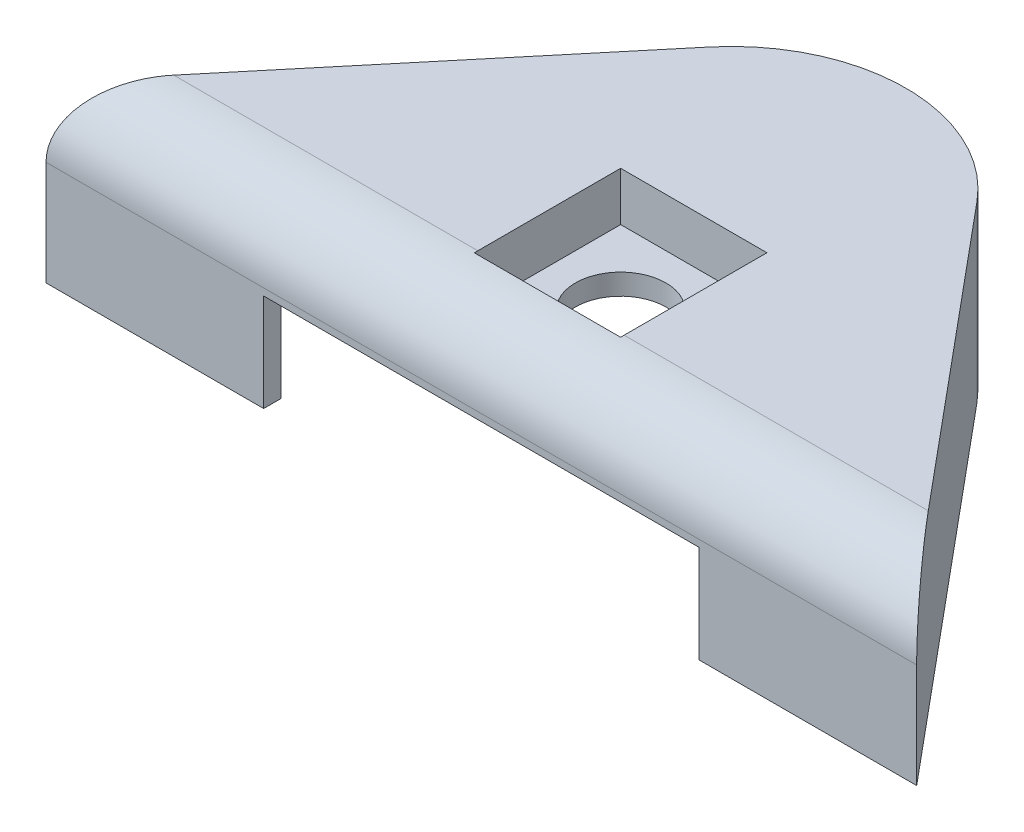
ISO-10303-21;
HEADER;
FILE_DESCRIPTION(('STEP AP214'),'2;1');
FILE_NAME('part.step','',(''),(''),'','','');
FILE_SCHEMA(('AUTOMOTIVE_DESIGN { 1 0 10303 214 1 1 1 1 }'));
ENDSEC;
DATA;
#1=APPLICATION_CONTEXT('core data for automotive mechanical design processes');
#2=APPLICATION_PROTOCOL_DEFINITION('international standard','automotive_design',2000,#1);
#3=PRODUCT_CONTEXT('',#1,'mechanical');
#4=PRODUCT('Part','Part','',(#3));
#5=PRODUCT_RELATED_PRODUCT_CATEGORY('part','',(#4));
#6=PRODUCT_DEFINITION_FORMATION('','',#4);
#7=PRODUCT_DEFINITION_CONTEXT('part definition',#1,'design');
#8=PRODUCT_DEFINITION('design','',#6,#7);
#9=PRODUCT_DEFINITION_SHAPE('','',#8);
#10=(LENGTH_UNIT() NAMED_UNIT(*) SI_UNIT(.MILLI.,.METRE.));
#11=(NAMED_UNIT(*) PLANE_ANGLE_UNIT() SI_UNIT($,.RADIAN.));
#12=(NAMED_UNIT(*) SI_UNIT($,.STERADIAN.) SOLID_ANGLE_UNIT());
#13=UNCERTAINTY_MEASURE_WITH_UNIT(LENGTH_MEASURE(1.E-05),#10,'distance_accuracy_value','');
#14=(GEOMETRIC_REPRESENTATION_CONTEXT(3) GLOBAL_UNCERTAINTY_ASSIGNED_CONTEXT((#13)) GLOBAL_UNIT_ASSIGNED_CONTEXT((#10,
#11,#12)) REPRESENTATION_CONTEXT('',''));
#15=CARTESIAN_POINT('',(0.,0.,0.));
#16=DIRECTION('',(0.,0.,1.));
#17=DIRECTION('',(1.,0.,0.));
#18=AXIS2_PLACEMENT_3D('',#15,#16,#17);
#19=CARTESIAN_POINT('',(0.,50.,3.1024967590666));
#20=DIRECTION('',(0.,-1.,0.));
#21=DIRECTION('',(0.,0.,-1.));
#22=AXIS2_PLACEMENT_3D('',#19,#20,#21);
#23=CYLINDRICAL_SURFACE('',#22,50.);
#24=CARTESIAN_POINT('',(0.,0.,3.1024967590666));
#25=DIRECTION('',(0.,1.,0.));
#26=DIRECTION('',(0.,0.,1.));
#27=AXIS2_PLACEMENT_3D('',#24,#25,#26);
#28=CIRCLE('',#27,50.);
#29=CARTESIAN_POINT('',(-38.4110639798692,0.,-28.9067232241572));
#30=VERTEX_POINT('',#29);
#31=CARTESIAN_POINT('',(38.4110639798689,0.,-28.906723224161));
#32=VERTEX_POINT('',#31);
#33=EDGE_CURVE('E259',#30,#32,#28,.F.);
#34=ORIENTED_EDGE('',*,*,#33,.F.);
#35=DIRECTION('',(0.,-1.,0.));
#36=VECTOR('',#35,1.);
#37=CARTESIAN_POINT('',(-38.4110639798692,50.,-28.9067232241572));
#38=LINE('',#37,#36);
#39=CARTESIAN_POINT('',(-38.4110639798692,50.,-28.9067232241572));
#40=VERTEX_POINT('',#39);
#41=EDGE_CURVE('E290',#40,#30,#38,.T.);
#42=ORIENTED_EDGE('',*,*,#41,.F.);
#43=CARTESIAN_POINT('',(0.,50.,3.1024967590666));
#44=DIRECTION('',(0.,1.,0.));
#45=DIRECTION('',(0.,0.,1.));
#46=AXIS2_PLACEMENT_3D('',#43,#44,#45);
#47=CIRCLE('',#46,50.);
#48=CARTESIAN_POINT('',(38.4110639798689,50.,-28.906723224161));
#49=VERTEX_POINT('',#48);
#50=EDGE_CURVE('E265',#40,#49,#47,.F.);
#51=ORIENTED_EDGE('',*,*,#50,.T.);
#52=DIRECTION('',(0.,-1.,0.));
#53=VECTOR('',#52,1.);
#54=CARTESIAN_POINT('',(38.4110639798689,50.,-28.906723224161));
#55=LINE('',#54,#53);
#56=EDGE_CURVE('E273',#49,#32,#55,.T.);
#57=ORIENTED_EDGE('',*,*,#56,.T.);
#58=EDGE_LOOP('',(#34,#42,#51,#57));
#59=FACE_BOUND('',#58,.T.);
#60=ADVANCED_FACE('F41',(#59),#23,.T.);
#61=CARTESIAN_POINT('',(-36.8852459016318,50.,-30.7377049180366));
#62=DIRECTION('',(-0.768221279597376,0.,-0.64018439966448));
#63=DIRECTION('',(-0.64018439966448,0.,0.768221279597376));
#64=AXIS2_PLACEMENT_3D('',#61,#62,#63);
#65=PLANE('',#64);
#66=DIRECTION('',(0.,-1.,0.));
#67=VECTOR('',#66,1.);
#68=CARTESIAN_POINT('',(-124.999999999992,50.,75.));
#69=LINE('',#68,#67);
#70=CARTESIAN_POINT('',(-124.999999999992,30.,75.));
#71=VERTEX_POINT('',#70);
#72=CARTESIAN_POINT('',(-124.999999999992,0.,75.));
#73=VERTEX_POINT('',#72);
#74=EDGE_CURVE('E288',#71,#73,#69,.T.);
#75=ORIENTED_EDGE('',*,*,#74,.F.);
#76=CARTESIAN_POINT('',(-108.333333333329,30.,55.));
#77=DIRECTION('',(-0.768221279597376,0.,-0.64018439966448));
#78=DIRECTION('',(-0.64018439966448,0.,0.768221279597376));
#79=AXIS2_PLACEMENT_3D('',#76,#77,#78);
#80=ELLIPSE('',#79,26.0341655863555,20.);
#81=CARTESIAN_POINT('',(-108.333333333329,50.,55.));
#82=VERTEX_POINT('',#81);
#83=EDGE_CURVE('E12',#71,#82,#80,.T.);
#84=ORIENTED_EDGE('',*,*,#83,.T.);
#85=DIRECTION('',(0.64018439966448,0.,-0.768221279597376));
#86=VECTOR('',#85,1.);
#87=CARTESIAN_POINT('',(-36.8852459016318,50.,-30.7377049180366));
#88=LINE('',#87,#86);
#89=EDGE_CURVE('E268',#82,#40,#88,.T.);
#90=ORIENTED_EDGE('',*,*,#89,.T.);
#91=ORIENTED_EDGE('',*,*,#41,.T.);
#92=DIRECTION('',(0.64018439966448,0.,-0.768221279597376));
#93=VECTOR('',#92,1.);
#94=CARTESIAN_POINT('',(-36.8852459016318,0.,-30.7377049180366));
#95=LINE('',#94,#93);
#96=EDGE_CURVE('E276',#73,#30,#95,.T.);
#97=ORIENTED_EDGE('',*,*,#96,.F.);
#98=EDGE_LOOP('',(#75,#84,#90,#91,#97));
#99=FACE_BOUND('',#98,.T.);
#100=ADVANCED_FACE('F325',(#99),#65,.T.);
#101=CARTESIAN_POINT('',(7.7715611723761E-12,50.,75.));
#102=DIRECTION('',(0.,0.,-1.));
#103=DIRECTION('',(-1.,0.,0.));
#104=AXIS2_PLACEMENT_3D('',#101,#102,#103);
#105=PLANE('',#104);
#106=DIRECTION('',(0.,-1.,0.));
#107=VECTOR('',#106,1.);
#108=CARTESIAN_POINT('',(125.,50.,75.0000000000001));
#109=LINE('',#108,#107);
#110=CARTESIAN_POINT('',(125.,30.,75.0000000000001));
#111=VERTEX_POINT('',#110);
#112=CARTESIAN_POINT('',(125.,0.,75.0000000000001));
#113=VERTEX_POINT('',#112);
#114=EDGE_CURVE('E286',#111,#113,#109,.T.);
#115=ORIENTED_EDGE('',*,*,#114,.F.);
#116=DIRECTION('',(1.,0.,0.));
#117=VECTOR('',#116,1.);
#118=CARTESIAN_POINT('',(-124.999999999992,30.,75.));
#119=LINE('',#118,#117);
#120=EDGE_CURVE('E49',#111,#71,#119,.F.);
#121=ORIENTED_EDGE('',*,*,#120,.T.);
#122=ORIENTED_EDGE('',*,*,#74,.T.);
#123=DIRECTION('',(1.,0.,0.));
#124=VECTOR('',#123,1.);
#125=CARTESIAN_POINT('',(7.7715611723761E-12,0.,75.));
#126=LINE('',#125,#124);
#127=CARTESIAN_POINT('',(-62.5,0.,75.));
#128=VERTEX_POINT('',#127);
#129=EDGE_CURVE('E280',#73,#128,#126,.T.);
#130=ORIENTED_EDGE('',*,*,#129,.T.);
#131=DIRECTION('',(0.,-1.,0.));
#132=VECTOR('',#131,1.);
#133=CARTESIAN_POINT('',(-62.5,28.,75.));
#134=LINE('',#133,#132);
#135=CARTESIAN_POINT('',(-62.5,28.,75.));
#136=VERTEX_POINT('',#135);
#137=EDGE_CURVE('E253',#136,#128,#134,.T.);
#138=ORIENTED_EDGE('',*,*,#137,.F.);
#139=DIRECTION('',(-1.,0.,0.));
#140=VECTOR('',#139,1.);
#141=CARTESIAN_POINT('',(-62.5,28.,75.));
#142=LINE('',#141,#140);
#143=CARTESIAN_POINT('',(62.5,28.,75.));
#144=VERTEX_POINT('',#143);
#145=EDGE_CURVE('E250',#144,#136,#142,.T.);
#146=ORIENTED_EDGE('',*,*,#145,.F.);
#147=DIRECTION('',(0.,1.,0.));
#148=VECTOR('',#147,1.);
#149=CARTESIAN_POINT('',(62.5,0.,75.));
#150=LINE('',#149,#148);
#151=CARTESIAN_POINT('',(62.5,0.,75.));
#152=VERTEX_POINT('',#151);
#153=EDGE_CURVE('E247',#152,#144,#150,.T.);
#154=ORIENTED_EDGE('',*,*,#153,.F.);
#155=EDGE_CURVE('E279',#152,#113,#126,.T.);
#156=ORIENTED_EDGE('',*,*,#155,.T.);
#157=EDGE_LOOP('',(#115,#121,#122,#130,#138,#146,#154,#156));
#158=FACE_BOUND('',#157,.T.);
#159=ADVANCED_FACE('F339',(#158),#105,.F.);
#160=CARTESIAN_POINT('',(36.8852459016471,50.,-30.7377049180328));
#161=DIRECTION('',(0.768221279597376,0.,-0.64018439966448));
#162=DIRECTION('',(-0.64018439966448,0.,-0.768221279597376));
#163=AXIS2_PLACEMENT_3D('',#160,#161,#162);
#164=PLANE('',#163);
#165=DIRECTION('',(0.64018439966448,0.,0.768221279597376));
#166=VECTOR('',#165,1.);
#167=CARTESIAN_POINT('',(36.8852459016471,50.,-30.7377049180328));
#168=LINE('',#167,#166);
#169=CARTESIAN_POINT('',(108.333333333341,50.,54.9999999999999));
#170=VERTEX_POINT('',#169);
#171=EDGE_CURVE('E271',#49,#170,#168,.T.);
#172=ORIENTED_EDGE('',*,*,#171,.T.);
#173=CARTESIAN_POINT('',(108.333333333341,30.,55.));
#174=DIRECTION('',(0.768221279597376,0.,-0.64018439966448));
#175=DIRECTION('',(-0.64018439966448,0.,-0.768221279597376));
#176=AXIS2_PLACEMENT_3D('',#173,#174,#175);
#177=ELLIPSE('',#176,26.0341655863555,20.);
#178=EDGE_CURVE('E63',#170,#111,#177,.T.);
#179=ORIENTED_EDGE('',*,*,#178,.T.);
#180=ORIENTED_EDGE('',*,*,#114,.T.);
#181=DIRECTION('',(0.64018439966448,0.,0.768221279597376));
#182=VECTOR('',#181,1.);
#183=CARTESIAN_POINT('',(36.8852459016471,0.,-30.7377049180328));
#184=LINE('',#183,#182);
#185=EDGE_CURVE('E269',#32,#113,#184,.T.);
#186=ORIENTED_EDGE('',*,*,#185,.F.);
#187=ORIENTED_EDGE('',*,*,#56,.F.);
#188=EDGE_LOOP('',(#172,#179,#180,#186,#187));
#189=FACE_BOUND('',#188,.T.);
#190=ADVANCED_FACE('F354',(#189),#164,.T.);
#191=CARTESIAN_POINT('',(0.,50.,0.));
#192=DIRECTION('',(0.,1.,0.));
#193=DIRECTION('',(0.,0.,1.));
#194=AXIS2_PLACEMENT_3D('',#191,#192,#193);
#195=PLANE('',#194);
#196=ORIENTED_EDGE('',*,*,#89,.F.);
#197=DIRECTION('',(1.,0.,0.));
#198=VECTOR('',#197,1.);
#199=CARTESIAN_POINT('',(125.,50.,55.));
#200=LINE('',#199,#198);
#201=CARTESIAN_POINT('',(-21.,50.,55.));
#202=VERTEX_POINT('',#201);
#203=EDGE_CURVE('E301',#82,#202,#200,.T.);
#204=ORIENTED_EDGE('',*,*,#203,.T.);
#205=DIRECTION('',(0.,0.,1.));
#206=VECTOR('',#205,1.);
#207=CARTESIAN_POINT('',(-21.,50.,56.));
#208=LINE('',#207,#206);
#209=CARTESIAN_POINT('',(-21.,50.,14.));
#210=VERTEX_POINT('',#209);
#211=EDGE_CURVE('E190',#210,#202,#208,.T.);
#212=ORIENTED_EDGE('',*,*,#211,.F.);
#213=DIRECTION('',(-1.,0.,0.));
#214=VECTOR('',#213,1.);
#215=CARTESIAN_POINT('',(-21.,50.,14.));
#216=LINE('',#215,#214);
#217=CARTESIAN_POINT('',(21.,50.,14.));
#218=VERTEX_POINT('',#217);
#219=EDGE_CURVE('E183',#218,#210,#216,.T.);
#220=ORIENTED_EDGE('',*,*,#219,.F.);
#221=DIRECTION('',(0.,0.,-1.));
#222=VECTOR('',#221,1.);
#223=CARTESIAN_POINT('',(21.,50.,56.));
#224=LINE('',#223,#222);
#225=CARTESIAN_POINT('',(21.,50.,55.));
#226=VERTEX_POINT('',#225);
#227=EDGE_CURVE('E195',#226,#218,#224,.T.);
#228=ORIENTED_EDGE('',*,*,#227,.F.);
#229=DIRECTION('',(1.,0.,0.));
#230=VECTOR('',#229,1.);
#231=CARTESIAN_POINT('',(125.,50.,55.));
#232=LINE('',#231,#230);
#233=EDGE_CURVE('E295',#226,#170,#232,.T.);
#234=ORIENTED_EDGE('',*,*,#233,.T.);
#235=ORIENTED_EDGE('',*,*,#171,.F.);
#236=ORIENTED_EDGE('',*,*,#50,.F.);
#237=EDGE_LOOP('',(#196,#204,#212,#220,#228,#234,#235,#236));
#238=FACE_BOUND('',#237,.T.);
#239=ADVANCED_FACE('F320',(#238),#195,.T.);
#240=CARTESIAN_POINT('',(0.,0.,0.));
#241=DIRECTION('',(0.,1.,0.));
#242=DIRECTION('',(0.,0.,1.));
#243=AXIS2_PLACEMENT_3D('',#240,#241,#242);
#244=PLANE('',#243);
#245=DIRECTION('',(0.640184399664445,0.,-0.768221279597404));
#246=VECTOR('',#245,1.);
#247=CARTESIAN_POINT('',(-114.324791936737,0.,69.9999999999999));
#248=LINE('',#247,#246);
#249=CARTESIAN_POINT('',(-114.324791936737,0.,69.9999999999999));
#250=VERTEX_POINT('',#249);
#251=CARTESIAN_POINT('',(-34.569957581882,0.,-25.7058012258351));
#252=VERTEX_POINT('',#251);
#253=EDGE_CURVE('E211',#250,#252,#248,.T.);
#254=ORIENTED_EDGE('',*,*,#253,.F.);
#255=DIRECTION('',(-1.,0.,0.));
#256=VECTOR('',#255,1.);
#257=CARTESIAN_POINT('',(114.324791936745,0.,70.));
#258=LINE('',#257,#256);
#259=CARTESIAN_POINT('',(-62.5,0.,69.9999999999999));
#260=VERTEX_POINT('',#259);
#261=EDGE_CURVE('E228',#260,#250,#258,.T.);
#262=ORIENTED_EDGE('',*,*,#261,.F.);
#263=DIRECTION('',(0.,0.,1.));
#264=VECTOR('',#263,1.);
#265=CARTESIAN_POINT('',(-62.5,0.,45.));
#266=LINE('',#265,#264);
#267=EDGE_CURVE('E260',#260,#128,#266,.T.);
#268=ORIENTED_EDGE('',*,*,#267,.T.);
#269=ORIENTED_EDGE('',*,*,#129,.F.);
#270=ORIENTED_EDGE('',*,*,#96,.T.);
#271=ORIENTED_EDGE('',*,*,#33,.T.);
#272=ORIENTED_EDGE('',*,*,#185,.T.);
#273=ORIENTED_EDGE('',*,*,#155,.F.);
#274=DIRECTION('',(0.,0.,1.));
#275=VECTOR('',#274,1.);
#276=CARTESIAN_POINT('',(62.5,0.,45.));
#277=LINE('',#276,#275);
#278=CARTESIAN_POINT('',(62.5,0.,70.));
#279=VERTEX_POINT('',#278);
#280=EDGE_CURVE('E257',#279,#152,#277,.T.);
#281=ORIENTED_EDGE('',*,*,#280,.F.);
#282=CARTESIAN_POINT('',(114.324791936745,0.,70.));
#283=VERTEX_POINT('',#282);
#284=EDGE_CURVE('E229',#283,#279,#258,.T.);
#285=ORIENTED_EDGE('',*,*,#284,.F.);
#286=DIRECTION('',(0.640184399664467,0.,0.768221279597387));
#287=VECTOR('',#286,1.);
#288=CARTESIAN_POINT('',(34.5699575818841,0.,-25.7058012258361));
#289=LINE('',#288,#287);
#290=CARTESIAN_POINT('',(34.5699575818841,0.,-25.7058012258361));
#291=VERTEX_POINT('',#290);
#292=EDGE_CURVE('E224',#291,#283,#289,.T.);
#293=ORIENTED_EDGE('',*,*,#292,.F.);
#294=CARTESIAN_POINT('',(1.47286870200159E-12,0.,3.1024967590646));
#295=DIRECTION('',(0.,-1.,0.));
#296=DIRECTION('',(0.,0.,-1.));
#297=AXIS2_PLACEMENT_3D('',#294,#295,#296);
#298=CIRCLE('',#297,45.);
#299=EDGE_CURVE('E221',#252,#291,#298,.T.);
#300=ORIENTED_EDGE('',*,*,#299,.F.);
#301=EDGE_LOOP('',(#254,#262,#268,#269,#270,#271,#272,#273,#281,#285,#293,#300));
#302=FACE_BOUND('',#301,.T.);
#303=ADVANCED_FACE('F334',(#302),#244,.F.);
#304=CARTESIAN_POINT('',(62.5,0.,45.));
#305=DIRECTION('',(1.,0.,0.));
#306=DIRECTION('',(0.,0.,-1.));
#307=AXIS2_PLACEMENT_3D('',#304,#305,#306);
#308=PLANE('',#307);
#309=DIRECTION('',(0.,0.,1.));
#310=VECTOR('',#309,1.);
#311=CARTESIAN_POINT('',(62.5,28.,45.));
#312=LINE('',#311,#310);
#313=CARTESIAN_POINT('',(62.5,28.,70.));
#314=VERTEX_POINT('',#313);
#315=EDGE_CURVE('E256',#314,#144,#312,.T.);
#316=ORIENTED_EDGE('',*,*,#315,.F.);
#317=DIRECTION('',(0.,-1.,0.));
#318=VECTOR('',#317,1.);
#319=CARTESIAN_POINT('',(62.5,0.,70.));
#320=LINE('',#319,#318);
#321=EDGE_CURVE('E244',#314,#279,#320,.T.);
#322=ORIENTED_EDGE('',*,*,#321,.T.);
#323=ORIENTED_EDGE('',*,*,#280,.T.);
#324=ORIENTED_EDGE('',*,*,#153,.T.);
#325=EDGE_LOOP('',(#316,#322,#323,#324));
#326=FACE_BOUND('',#325,.T.);
#327=ADVANCED_FACE('F349',(#326),#308,.F.);
#328=CARTESIAN_POINT('',(-62.5,28.,45.));
#329=DIRECTION('',(-1.,0.,0.));
#330=DIRECTION('',(0.,0.,1.));
#331=AXIS2_PLACEMENT_3D('',#328,#329,#330);
#332=PLANE('',#331);
#333=ORIENTED_EDGE('',*,*,#267,.F.);
#334=DIRECTION('',(0.,1.,0.));
#335=VECTOR('',#334,1.);
#336=CARTESIAN_POINT('',(-62.5,28.,69.9999999999999));
#337=LINE('',#336,#335);
#338=CARTESIAN_POINT('',(-62.5,28.,69.9999999999999));
#339=VERTEX_POINT('',#338);
#340=EDGE_CURVE('E235',#260,#339,#337,.T.);
#341=ORIENTED_EDGE('',*,*,#340,.T.);
#342=DIRECTION('',(0.,0.,1.));
#343=VECTOR('',#342,1.);
#344=CARTESIAN_POINT('',(-62.5,28.,45.));
#345=LINE('',#344,#343);
#346=EDGE_CURVE('E262',#339,#136,#345,.T.);
#347=ORIENTED_EDGE('',*,*,#346,.T.);
#348=ORIENTED_EDGE('',*,*,#137,.T.);
#349=EDGE_LOOP('',(#333,#341,#347,#348));
#350=FACE_BOUND('',#349,.T.);
#351=ADVANCED_FACE('F343',(#350),#332,.F.);
#352=CARTESIAN_POINT('',(-62.5,28.,45.));
#353=DIRECTION('',(0.,1.,0.));
#354=DIRECTION('',(-1.,0.,0.));
#355=AXIS2_PLACEMENT_3D('',#352,#353,#354);
#356=PLANE('',#355);
#357=ORIENTED_EDGE('',*,*,#346,.F.);
#358=DIRECTION('',(1.,0.,0.));
#359=VECTOR('',#358,1.);
#360=CARTESIAN_POINT('',(-62.5,28.,69.9999999999999));
#361=LINE('',#360,#359);
#362=EDGE_CURVE('E292',#339,#314,#361,.T.);
#363=ORIENTED_EDGE('',*,*,#362,.T.);
#364=ORIENTED_EDGE('',*,*,#315,.T.);
#365=ORIENTED_EDGE('',*,*,#145,.T.);
#366=EDGE_LOOP('',(#357,#363,#364,#365));
#367=FACE_BOUND('',#366,.T.);
#368=ADVANCED_FACE('F346',(#367),#356,.F.);
#369=CARTESIAN_POINT('',(114.324791936745,30.,70.));
#370=DIRECTION('',(0.,0.,1.));
#371=DIRECTION('',(1.,0.,0.));
#372=AXIS2_PLACEMENT_3D('',#369,#370,#371);
#373=PLANE('',#372);
#374=ORIENTED_EDGE('',*,*,#362,.F.);
#375=ORIENTED_EDGE('',*,*,#340,.F.);
#376=ORIENTED_EDGE('',*,*,#261,.T.);
#377=DIRECTION('',(0.,-1.,0.));
#378=VECTOR('',#377,1.);
#379=CARTESIAN_POINT('',(-114.324791936737,30.,69.9999999999999));
#380=LINE('',#379,#378);
#381=CARTESIAN_POINT('',(-114.324791936737,30.,69.9999999999999));
#382=VERTEX_POINT('',#381);
#383=EDGE_CURVE('E236',#382,#250,#380,.T.);
#384=ORIENTED_EDGE('',*,*,#383,.F.);
#385=DIRECTION('',(-1.,0.,0.));
#386=VECTOR('',#385,1.);
#387=CARTESIAN_POINT('',(114.324791936745,30.,70.));
#388=LINE('',#387,#386);
#389=CARTESIAN_POINT('',(114.324791936745,30.,70.));
#390=VERTEX_POINT('',#389);
#391=EDGE_CURVE('E214',#390,#382,#388,.T.);
#392=ORIENTED_EDGE('',*,*,#391,.F.);
#393=DIRECTION('',(0.,-1.,0.));
#394=VECTOR('',#393,1.);
#395=CARTESIAN_POINT('',(114.324791936745,30.,70.));
#396=LINE('',#395,#394);
#397=EDGE_CURVE('E239',#390,#283,#396,.T.);
#398=ORIENTED_EDGE('',*,*,#397,.T.);
#399=ORIENTED_EDGE('',*,*,#284,.T.);
#400=ORIENTED_EDGE('',*,*,#321,.F.);
#401=EDGE_LOOP('',(#374,#375,#376,#384,#392,#398,#399,#400));
#402=FACE_BOUND('',#401,.T.);
#403=ADVANCED_FACE('F424',(#402),#373,.F.);
#404=CARTESIAN_POINT('',(1.47286870200159E-12,30.,3.1024967590646));
#405=DIRECTION('',(0.,-1.,0.));
#406=DIRECTION('',(0.,0.,-1.));
#407=AXIS2_PLACEMENT_3D('',#404,#405,#406);
#408=CYLINDRICAL_SURFACE('',#407,45.);
#409=ORIENTED_EDGE('',*,*,#299,.T.);
#410=DIRECTION('',(0.,-1.,0.));
#411=VECTOR('',#410,1.);
#412=CARTESIAN_POINT('',(34.5699575818841,30.,-25.7058012258361));
#413=LINE('',#412,#411);
#414=CARTESIAN_POINT('',(34.5699575818841,30.,-25.7058012258361));
#415=VERTEX_POINT('',#414);
#416=EDGE_CURVE('E220',#415,#291,#413,.T.);
#417=ORIENTED_EDGE('',*,*,#416,.F.);
#418=CARTESIAN_POINT('',(1.47286870200159E-12,30.,3.1024967590646));
#419=DIRECTION('',(0.,-1.,0.));
#420=DIRECTION('',(0.,0.,-1.));
#421=AXIS2_PLACEMENT_3D('',#418,#419,#420);
#422=CIRCLE('',#421,45.);
#423=CARTESIAN_POINT('',(-34.569957581882,30.,-25.7058012258351));
#424=VERTEX_POINT('',#423);
#425=EDGE_CURVE('E207',#424,#415,#422,.T.);
#426=ORIENTED_EDGE('',*,*,#425,.F.);
#427=DIRECTION('',(0.,-1.,0.));
#428=VECTOR('',#427,1.);
#429=CARTESIAN_POINT('',(-34.569957581882,30.,-25.7058012258351));
#430=LINE('',#429,#428);
#431=EDGE_CURVE('E233',#424,#252,#430,.T.);
#432=ORIENTED_EDGE('',*,*,#431,.T.);
#433=EDGE_LOOP('',(#409,#417,#426,#432));
#434=FACE_BOUND('',#433,.T.);
#435=ADVANCED_FACE('F433',(#434),#408,.F.);
#436=CARTESIAN_POINT('',(-114.324791936737,30.,69.9999999999999));
#437=DIRECTION('',(-0.768221279597404,0.,-0.640184399664445));
#438=DIRECTION('',(-0.640184399664445,0.,0.768221279597404));
#439=AXIS2_PLACEMENT_3D('',#436,#437,#438);
#440=PLANE('',#439);
#441=ORIENTED_EDGE('',*,*,#253,.T.);
#442=ORIENTED_EDGE('',*,*,#431,.F.);
#443=DIRECTION('',(0.640184399664445,0.,-0.768221279597404));
#444=VECTOR('',#443,1.);
#445=CARTESIAN_POINT('',(-114.324791936737,30.,69.9999999999999));
#446=LINE('',#445,#444);
#447=EDGE_CURVE('E217',#382,#424,#446,.T.);
#448=ORIENTED_EDGE('',*,*,#447,.F.);
#449=ORIENTED_EDGE('',*,*,#383,.T.);
#450=EDGE_LOOP('',(#441,#442,#448,#449));
#451=FACE_BOUND('',#450,.T.);
#452=ADVANCED_FACE('F443',(#451),#440,.F.);
#453=CARTESIAN_POINT('',(34.5699575818841,30.,-25.7058012258361));
#454=DIRECTION('',(0.768221279597387,0.,-0.640184399664467));
#455=DIRECTION('',(-0.640184399664467,0.,-0.768221279597387));
#456=AXIS2_PLACEMENT_3D('',#453,#454,#455);
#457=PLANE('',#456);
#458=ORIENTED_EDGE('',*,*,#292,.T.);
#459=ORIENTED_EDGE('',*,*,#397,.F.);
#460=DIRECTION('',(0.640184399664467,0.,0.768221279597387));
#461=VECTOR('',#460,1.);
#462=CARTESIAN_POINT('',(34.5699575818841,30.,-25.7058012258361));
#463=LINE('',#462,#461);
#464=EDGE_CURVE('E210',#415,#390,#463,.T.);
#465=ORIENTED_EDGE('',*,*,#464,.F.);
#466=ORIENTED_EDGE('',*,*,#416,.T.);
#467=EDGE_LOOP('',(#458,#459,#465,#466));
#468=FACE_BOUND('',#467,.T.);
#469=ADVANCED_FACE('F453',(#468),#457,.F.);
#470=CARTESIAN_POINT('',(1.47286870200159E-12,30.,3.1024967590646));
#471=DIRECTION('',(0.,-1.,0.));
#472=DIRECTION('',(0.,0.,-1.));
#473=AXIS2_PLACEMENT_3D('',#470,#471,#472);
#474=PLANE('',#473);
#475=CARTESIAN_POINT('',(0.,30.,35.));
#476=DIRECTION('',(0.,-1.,0.));
#477=DIRECTION('',(0.,0.,-1.));
#478=AXIS2_PLACEMENT_3D('',#475,#476,#477);
#479=CIRCLE('',#478,13.);
#480=CARTESIAN_POINT('',(0.,30.,22.));
#481=VERTEX_POINT('',#480);
#482=EDGE_CURVE('E225',#481,#481,#479,.T.);
#483=ORIENTED_EDGE('',*,*,#482,.F.);
#484=EDGE_LOOP('',(#483));
#485=FACE_BOUND('',#484,.T.);
#486=ORIENTED_EDGE('',*,*,#425,.T.);
#487=ORIENTED_EDGE('',*,*,#464,.T.);
#488=ORIENTED_EDGE('',*,*,#391,.T.);
#489=ORIENTED_EDGE('',*,*,#447,.T.);
#490=EDGE_LOOP('',(#486,#487,#488,#489));
#491=FACE_BOUND('',#490,.T.);
#492=ADVANCED_FACE('F463',(#485,#491),#474,.T.);
#493=CARTESIAN_POINT('',(0.,20.,35.));
#494=DIRECTION('',(0.,1.,0.));
#495=DIRECTION('',(0.,0.,1.));
#496=AXIS2_PLACEMENT_3D('',#493,#494,#495);
#497=CYLINDRICAL_SURFACE('',#496,13.);
#498=CARTESIAN_POINT('',(0.,36.,35.));
#499=DIRECTION('',(0.,-1.,0.));
#500=DIRECTION('',(0.,0.,-1.));
#501=AXIS2_PLACEMENT_3D('',#498,#499,#500);
#502=CIRCLE('',#501,13.);
#503=CARTESIAN_POINT('',(0.,36.,22.));
#504=VERTEX_POINT('',#503);
#505=EDGE_CURVE('E206',#504,#504,#502,.F.);
#506=ORIENTED_EDGE('',*,*,#505,.T.);
#507=EDGE_LOOP('',(#506));
#508=FACE_BOUND('',#507,.T.);
#509=ORIENTED_EDGE('',*,*,#482,.T.);
#510=EDGE_LOOP('',(#509));
#511=FACE_BOUND('',#510,.T.);
#512=ADVANCED_FACE('F473',(#508,#511),#497,.F.);
#513=CARTESIAN_POINT('',(1.47286870200159E-12,36.,3.1024967590646));
#514=DIRECTION('',(0.,-1.,0.));
#515=DIRECTION('',(0.,0.,-1.));
#516=AXIS2_PLACEMENT_3D('',#513,#514,#515);
#517=PLANE('',#516);
#518=DIRECTION('',(0.,0.,-1.));
#519=VECTOR('',#518,1.);
#520=CARTESIAN_POINT('',(21.,36.,56.));
#521=LINE('',#520,#519);
#522=CARTESIAN_POINT('',(21.,36.,56.));
#523=VERTEX_POINT('',#522);
#524=CARTESIAN_POINT('',(21.,36.,14.));
#525=VERTEX_POINT('',#524);
#526=EDGE_CURVE('E188',#523,#525,#521,.T.);
#527=ORIENTED_EDGE('',*,*,#526,.T.);
#528=DIRECTION('',(-1.,0.,0.));
#529=VECTOR('',#528,1.);
#530=CARTESIAN_POINT('',(-21.,36.,14.));
#531=LINE('',#530,#529);
#532=CARTESIAN_POINT('',(-21.,36.,14.));
#533=VERTEX_POINT('',#532);
#534=EDGE_CURVE('E180',#525,#533,#531,.T.);
#535=ORIENTED_EDGE('',*,*,#534,.T.);
#536=DIRECTION('',(0.,0.,1.));
#537=VECTOR('',#536,1.);
#538=CARTESIAN_POINT('',(-21.,36.,56.));
#539=LINE('',#538,#537);
#540=CARTESIAN_POINT('',(-21.,36.,56.));
#541=VERTEX_POINT('',#540);
#542=EDGE_CURVE('E165',#533,#541,#539,.T.);
#543=ORIENTED_EDGE('',*,*,#542,.T.);
#544=DIRECTION('',(1.,0.,0.));
#545=VECTOR('',#544,1.);
#546=CARTESIAN_POINT('',(-21.,36.,56.));
#547=LINE('',#546,#545);
#548=EDGE_CURVE('E200',#541,#523,#547,.T.);
#549=ORIENTED_EDGE('',*,*,#548,.T.);
#550=EDGE_LOOP('',(#527,#535,#543,#549));
#551=FACE_BOUND('',#550,.T.);
#552=ORIENTED_EDGE('',*,*,#505,.F.);
#553=EDGE_LOOP('',(#552));
#554=FACE_BOUND('',#553,.T.);
#555=ADVANCED_FACE('F186',(#551,#554),#517,.F.);
#556=CARTESIAN_POINT('',(-21.,-29.39696961967,14.));
#557=DIRECTION('',(0.,0.,-1.));
#558=DIRECTION('',(-1.,0.,0.));
#559=AXIS2_PLACEMENT_3D('',#556,#557,#558);
#560=PLANE('',#559);
#561=DIRECTION('',(0.,1.,0.));
#562=VECTOR('',#561,1.);
#563=CARTESIAN_POINT('',(21.,-29.39696961967,14.));
#564=LINE('',#563,#562);
#565=EDGE_CURVE('E198',#525,#218,#564,.T.);
#566=ORIENTED_EDGE('',*,*,#565,.T.);
#567=ORIENTED_EDGE('',*,*,#219,.T.);
#568=DIRECTION('',(0.,1.,0.));
#569=VECTOR('',#568,1.);
#570=CARTESIAN_POINT('',(-21.,-29.39696961967,14.));
#571=LINE('',#570,#569);
#572=EDGE_CURVE('E169',#533,#210,#571,.T.);
#573=ORIENTED_EDGE('',*,*,#572,.F.);
#574=ORIENTED_EDGE('',*,*,#534,.F.);
#575=EDGE_LOOP('',(#566,#567,#573,#574));
#576=FACE_BOUND('',#575,.T.);
#577=ADVANCED_FACE('F179',(#576),#560,.F.);
#578=CARTESIAN_POINT('',(-21.,-29.39696961967,56.));
#579=DIRECTION('',(-1.,0.,0.));
#580=DIRECTION('',(0.,0.,1.));
#581=AXIS2_PLACEMENT_3D('',#578,#579,#580);
#582=PLANE('',#581);
#583=ORIENTED_EDGE('',*,*,#211,.T.);
#584=CARTESIAN_POINT('',(-21.,30.,55.));
#585=DIRECTION('',(-1.,0.,0.));
#586=DIRECTION('',(0.,0.,1.));
#587=AXIS2_PLACEMENT_3D('',#584,#585,#586);
#588=CIRCLE('',#587,20.);
#589=CARTESIAN_POINT('',(-21.,49.9749843554382,56.));
#590=VERTEX_POINT('',#589);
#591=EDGE_CURVE('E304',#202,#590,#588,.F.);
#592=ORIENTED_EDGE('',*,*,#591,.T.);
#593=DIRECTION('',(0.,1.,0.));
#594=VECTOR('',#593,1.);
#595=CARTESIAN_POINT('',(-21.,-29.39696961967,56.));
#596=LINE('',#595,#594);
#597=EDGE_CURVE('E172',#541,#590,#596,.T.);
#598=ORIENTED_EDGE('',*,*,#597,.F.);
#599=ORIENTED_EDGE('',*,*,#542,.F.);
#600=ORIENTED_EDGE('',*,*,#572,.T.);
#601=EDGE_LOOP('',(#583,#592,#598,#599,#600));
#602=FACE_BOUND('',#601,.T.);
#603=ADVANCED_FACE('F168',(#602),#582,.F.);
#604=CARTESIAN_POINT('',(-21.,-29.39696961967,56.));
#605=DIRECTION('',(0.,0.,1.));
#606=DIRECTION('',(1.,0.,0.));
#607=AXIS2_PLACEMENT_3D('',#604,#605,#606);
#608=PLANE('',#607);
#609=ORIENTED_EDGE('',*,*,#597,.T.);
#610=DIRECTION('',(-1.,0.,0.));
#611=VECTOR('',#610,1.);
#612=CARTESIAN_POINT('',(-21.,49.9749843554382,56.));
#613=LINE('',#612,#611);
#614=CARTESIAN_POINT('',(21.,49.9749843554382,56.));
#615=VERTEX_POINT('',#614);
#616=EDGE_CURVE('E306',#590,#615,#613,.F.);
#617=ORIENTED_EDGE('',*,*,#616,.T.);
#618=DIRECTION('',(0.,1.,0.));
#619=VECTOR('',#618,1.);
#620=CARTESIAN_POINT('',(21.,-29.39696961967,56.));
#621=LINE('',#620,#619);
#622=EDGE_CURVE('E199',#523,#615,#621,.T.);
#623=ORIENTED_EDGE('',*,*,#622,.F.);
#624=ORIENTED_EDGE('',*,*,#548,.F.);
#625=EDGE_LOOP('',(#609,#617,#623,#624));
#626=FACE_BOUND('',#625,.T.);
#627=ADVANCED_FACE('F503',(#626),#608,.F.);
#628=CARTESIAN_POINT('',(21.,-29.39696961967,56.));
#629=DIRECTION('',(1.,0.,0.));
#630=DIRECTION('',(0.,0.,-1.));
#631=AXIS2_PLACEMENT_3D('',#628,#629,#630);
#632=PLANE('',#631);
#633=ORIENTED_EDGE('',*,*,#622,.T.);
#634=CARTESIAN_POINT('',(21.,30.,55.));
#635=DIRECTION('',(1.,0.,0.));
#636=DIRECTION('',(0.,0.,-1.));
#637=AXIS2_PLACEMENT_3D('',#634,#635,#636);
#638=CIRCLE('',#637,20.);
#639=EDGE_CURVE('E308',#615,#226,#638,.F.);
#640=ORIENTED_EDGE('',*,*,#639,.T.);
#641=ORIENTED_EDGE('',*,*,#227,.T.);
#642=ORIENTED_EDGE('',*,*,#565,.F.);
#643=ORIENTED_EDGE('',*,*,#526,.F.);
#644=EDGE_LOOP('',(#633,#640,#641,#642,#643));
#645=FACE_BOUND('',#644,.T.);
#646=ADVANCED_FACE('F313',(#645),#632,.F.);
#647=CARTESIAN_POINT('',(0.,30.,55.));
#648=DIRECTION('',(-1.,0.,0.));
#649=DIRECTION('',(0.,0.,1.));
#650=AXIS2_PLACEMENT_3D('',#647,#648,#649);
#651=CYLINDRICAL_SURFACE('',#650,20.);
#652=ORIENTED_EDGE('',*,*,#83,.F.);
#653=ORIENTED_EDGE('',*,*,#120,.F.);
#654=ORIENTED_EDGE('',*,*,#178,.F.);
#655=ORIENTED_EDGE('',*,*,#233,.F.);
#656=ORIENTED_EDGE('',*,*,#639,.F.);
#657=ORIENTED_EDGE('',*,*,#616,.F.);
#658=ORIENTED_EDGE('',*,*,#591,.F.);
#659=ORIENTED_EDGE('',*,*,#203,.F.);
#660=EDGE_LOOP('',(#652,#653,#654,#655,#656,#657,#658,#659));
#661=FACE_BOUND('',#660,.T.);
#662=ADVANCED_FACE('F43',(#661),#651,.T.);
#663=CLOSED_SHELL('',(#60,#100,#159,#190,#239,#303,#327,#351,#368,#403,#435,#452,#469,#492,#512,
#555,#577,#603,#627,#646,#662));
#664=MANIFOLD_SOLID_BREP('B2',#663);
#665=ADVANCED_BREP_SHAPE_REPRESENTATION('',(#18,#664),#14);
#666=SHAPE_DEFINITION_REPRESENTATION(#9,#665);
ENDSEC;
END-ISO-10303-21;
